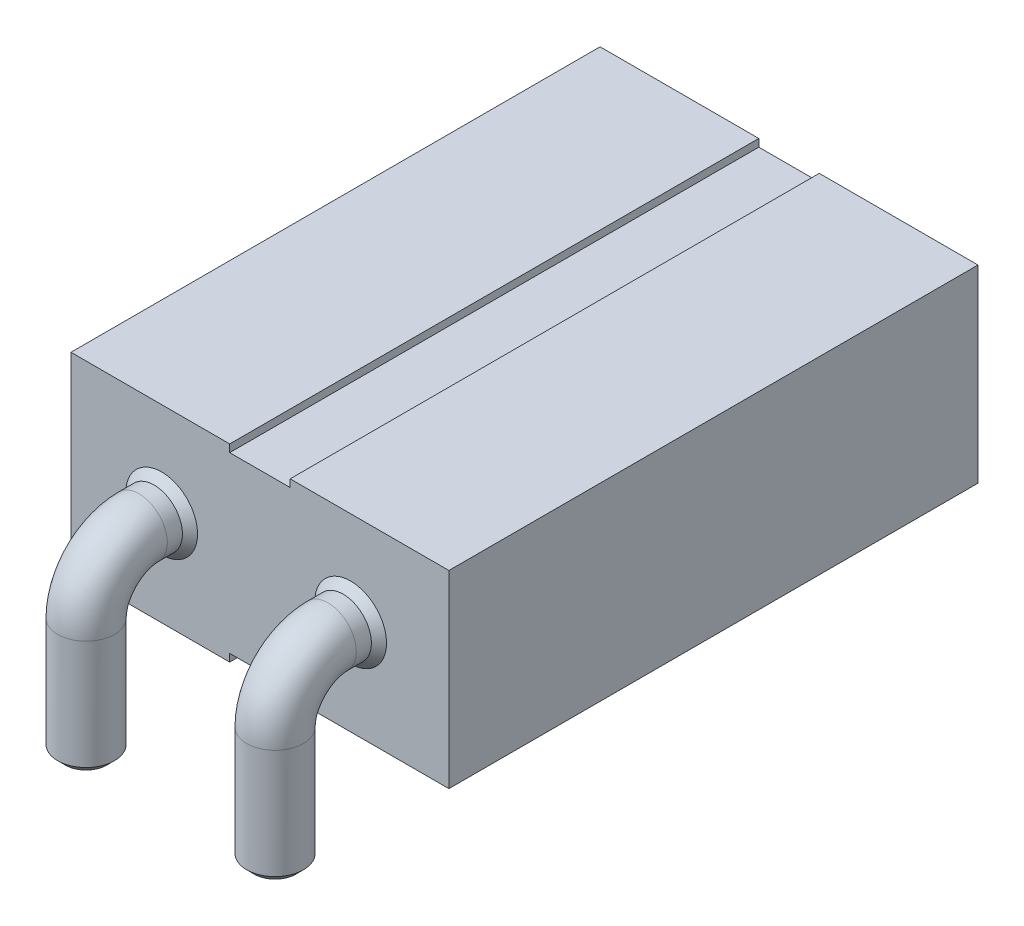
ISO-10303-21;
HEADER;
FILE_DESCRIPTION(('STEP AP214'),'2;1');
FILE_NAME('part.step','',(''),(''),'','','');
FILE_SCHEMA(('AUTOMOTIVE_DESIGN { 1 0 10303 214 1 1 1 1 }'));
ENDSEC;
DATA;
#1=APPLICATION_CONTEXT('core data for automotive mechanical design processes');
#2=APPLICATION_PROTOCOL_DEFINITION('international standard','automotive_design',2000,#1);
#3=PRODUCT_CONTEXT('',#1,'mechanical');
#4=PRODUCT('Part','Part','',(#3));
#5=PRODUCT_RELATED_PRODUCT_CATEGORY('part','',(#4));
#6=PRODUCT_DEFINITION_FORMATION('','',#4);
#7=PRODUCT_DEFINITION_CONTEXT('part definition',#1,'design');
#8=PRODUCT_DEFINITION('design','',#6,#7);
#9=PRODUCT_DEFINITION_SHAPE('','',#8);
#10=(LENGTH_UNIT() NAMED_UNIT(*) SI_UNIT(.MILLI.,.METRE.));
#11=(NAMED_UNIT(*) PLANE_ANGLE_UNIT() SI_UNIT($,.RADIAN.));
#12=(NAMED_UNIT(*) SI_UNIT($,.STERADIAN.) SOLID_ANGLE_UNIT());
#13=UNCERTAINTY_MEASURE_WITH_UNIT(LENGTH_MEASURE(1.E-05),#10,'distance_accuracy_value','');
#14=(GEOMETRIC_REPRESENTATION_CONTEXT(3) GLOBAL_UNCERTAINTY_ASSIGNED_CONTEXT((#13)) GLOBAL_UNIT_ASSIGNED_CONTEXT((#10,
#11,#12)) REPRESENTATION_CONTEXT('',''));
#15=CARTESIAN_POINT('',(0.,0.,0.));
#16=DIRECTION('',(0.,0.,1.));
#17=DIRECTION('',(1.,0.,0.));
#18=AXIS2_PLACEMENT_3D('',#15,#16,#17);
#19=CARTESIAN_POINT('',(-2.50000000000002,2.5,3.50000000000001));
#20=DIRECTION('',(0.,0.,-1.));
#21=DIRECTION('',(-1.,0.,0.));
#22=AXIS2_PLACEMENT_3D('',#19,#20,#21);
#23=PLANE('',#22);
#24=CARTESIAN_POINT('',(-1.30000000000002,1.25420841678192,3.50000000000001));
#25=DIRECTION('',(0.,0.,-1.));
#26=DIRECTION('',(-1.,0.,0.));
#27=AXIS2_PLACEMENT_3D('',#24,#25,#26);
#28=CIRCLE('',#27,0.474999999999999);
#29=CARTESIAN_POINT('',(-1.77500000000001,1.25420841678192,3.50000000000001));
#30=VERTEX_POINT('',#29);
#31=EDGE_CURVE('E11',#30,#30,#28,.T.);
#32=ORIENTED_EDGE('',*,*,#31,.T.);
#33=EDGE_LOOP('',(#32));
#34=FACE_BOUND('',#33,.T.);
#35=DIRECTION('',(0.,-1.,0.));
#36=VECTOR('',#35,1.);
#37=CARTESIAN_POINT('',(-0.400000000000016,2.5,3.50000000000001));
#38=LINE('',#37,#36);
#39=CARTESIAN_POINT('',(-0.400000000000016,0.0999999999999998,3.50000000000001));
#40=VERTEX_POINT('',#39);
#41=CARTESIAN_POINT('',(-0.400000000000016,0.,3.50000000000001));
#42=VERTEX_POINT('',#41);
#43=EDGE_CURVE('E155',#40,#42,#38,.T.);
#44=ORIENTED_EDGE('',*,*,#43,.F.);
#45=DIRECTION('',(-1.,0.,0.));
#46=VECTOR('',#45,1.);
#47=CARTESIAN_POINT('',(-2.50000000000002,0.0999999999999998,3.50000000000001));
#48=LINE('',#47,#46);
#49=CARTESIAN_POINT('',(0.399999999999984,0.0999999999999998,3.50000000000001));
#50=VERTEX_POINT('',#49);
#51=EDGE_CURVE('E132',#50,#40,#48,.T.);
#52=ORIENTED_EDGE('',*,*,#51,.F.);
#53=DIRECTION('',(0.,1.,0.));
#54=VECTOR('',#53,1.);
#55=CARTESIAN_POINT('',(0.399999999999985,2.5,3.50000000000001));
#56=LINE('',#55,#54);
#57=CARTESIAN_POINT('',(0.399999999999984,0.,3.50000000000001));
#58=VERTEX_POINT('',#57);
#59=EDGE_CURVE('E152',#58,#50,#56,.T.);
#60=ORIENTED_EDGE('',*,*,#59,.F.);
#61=DIRECTION('',(1.,0.,0.));
#62=VECTOR('',#61,1.);
#63=CARTESIAN_POINT('',(-2.50000000000002,0.,3.50000000000001));
#64=LINE('',#63,#62);
#65=CARTESIAN_POINT('',(2.49999999999998,0.,3.50000000000001));
#66=VERTEX_POINT('',#65);
#67=EDGE_CURVE('E212',#58,#66,#64,.T.);
#68=ORIENTED_EDGE('',*,*,#67,.T.);
#69=DIRECTION('',(0.,-1.,0.));
#70=VECTOR('',#69,1.);
#71=CARTESIAN_POINT('',(2.49999999999998,2.5,3.50000000000001));
#72=LINE('',#71,#70);
#73=CARTESIAN_POINT('',(2.49999999999998,2.5,3.50000000000001));
#74=VERTEX_POINT('',#73);
#75=EDGE_CURVE('E204',#74,#66,#72,.T.);
#76=ORIENTED_EDGE('',*,*,#75,.F.);
#77=DIRECTION('',(1.,0.,0.));
#78=VECTOR('',#77,1.);
#79=CARTESIAN_POINT('',(-2.50000000000002,2.5,3.50000000000001));
#80=LINE('',#79,#78);
#81=CARTESIAN_POINT('',(0.399999999999985,2.5,3.50000000000001));
#82=VERTEX_POINT('',#81);
#83=EDGE_CURVE('E200',#82,#74,#80,.T.);
#84=ORIENTED_EDGE('',*,*,#83,.F.);
#85=DIRECTION('',(0.,-1.,0.));
#86=VECTOR('',#85,1.);
#87=CARTESIAN_POINT('',(0.399999999999985,2.5,3.50000000000001));
#88=LINE('',#87,#86);
#89=CARTESIAN_POINT('',(0.399999999999984,2.4,3.50000000000001));
#90=VERTEX_POINT('',#89);
#91=EDGE_CURVE('E58',#82,#90,#88,.T.);
#92=ORIENTED_EDGE('',*,*,#91,.T.);
#93=DIRECTION('',(-1.,0.,0.));
#94=VECTOR('',#93,1.);
#95=CARTESIAN_POINT('',(-2.50000000000002,2.4,3.50000000000001));
#96=LINE('',#95,#94);
#97=CARTESIAN_POINT('',(-0.400000000000016,2.4,3.50000000000001));
#98=VERTEX_POINT('',#97);
#99=EDGE_CURVE('E174',#90,#98,#96,.T.);
#100=ORIENTED_EDGE('',*,*,#99,.T.);
#101=DIRECTION('',(0.,1.,0.));
#102=VECTOR('',#101,1.);
#103=CARTESIAN_POINT('',(-0.400000000000016,2.5,3.50000000000001));
#104=LINE('',#103,#102);
#105=CARTESIAN_POINT('',(-0.400000000000016,2.5,3.50000000000001));
#106=VERTEX_POINT('',#105);
#107=EDGE_CURVE('E171',#98,#106,#104,.T.);
#108=ORIENTED_EDGE('',*,*,#107,.T.);
#109=CARTESIAN_POINT('',(-2.50000000000002,2.5,3.50000000000001));
#110=VERTEX_POINT('',#109);
#111=EDGE_CURVE('E201',#110,#106,#80,.T.);
#112=ORIENTED_EDGE('',*,*,#111,.F.);
#113=DIRECTION('',(0.,-1.,0.));
#114=VECTOR('',#113,1.);
#115=CARTESIAN_POINT('',(-2.50000000000002,2.5,3.50000000000001));
#116=LINE('',#115,#114);
#117=CARTESIAN_POINT('',(-2.50000000000002,0.,3.50000000000001));
#118=VERTEX_POINT('',#117);
#119=EDGE_CURVE('E217',#110,#118,#116,.T.);
#120=ORIENTED_EDGE('',*,*,#119,.T.);
#121=EDGE_CURVE('E194',#118,#42,#64,.T.);
#122=ORIENTED_EDGE('',*,*,#121,.T.);
#123=EDGE_LOOP('',(#44,#52,#60,#68,#76,#84,#92,#100,#108,#112,#120,#122));
#124=FACE_BOUND('',#123,.T.);
#125=CARTESIAN_POINT('',(1.19999999999998,1.25420841678192,3.50000000000001));
#126=DIRECTION('',(0.,0.,-1.));
#127=DIRECTION('',(-1.,0.,0.));
#128=AXIS2_PLACEMENT_3D('',#125,#126,#127);
#129=CIRCLE('',#128,0.475000000000001);
#130=CARTESIAN_POINT('',(0.724999999999983,1.25420841678192,3.50000000000001));
#131=VERTEX_POINT('',#130);
#132=EDGE_CURVE('E235',#131,#131,#129,.T.);
#133=ORIENTED_EDGE('',*,*,#132,.T.);
#134=EDGE_LOOP('',(#133));
#135=FACE_BOUND('',#134,.T.);
#136=ADVANCED_FACE('F35',(#34,#124,#135),#23,.F.);
#137=CARTESIAN_POINT('',(-2.50000000000002,2.5,-3.49999999999999));
#138=DIRECTION('',(0.,0.,1.));
#139=DIRECTION('',(1.,0.,0.));
#140=AXIS2_PLACEMENT_3D('',#137,#138,#139);
#141=PLANE('',#140);
#142=CARTESIAN_POINT('',(-1.30000000000002,1.25,-3.49999999999999));
#143=DIRECTION('',(0.,0.,-1.));
#144=DIRECTION('',(-1.,0.,0.));
#145=AXIS2_PLACEMENT_3D('',#142,#143,#144);
#146=CIRCLE('',#145,0.75);
#147=CARTESIAN_POINT('',(-2.05000000000002,1.25,-3.49999999999999));
#148=VERTEX_POINT('',#147);
#149=EDGE_CURVE('E567',#148,#148,#146,.T.);
#150=ORIENTED_EDGE('',*,*,#149,.F.);
#151=EDGE_LOOP('',(#150));
#152=FACE_BOUND('',#151,.T.);
#153=CARTESIAN_POINT('',(1.19999999999998,1.25,-3.49999999999999));
#154=DIRECTION('',(0.,0.,-1.));
#155=DIRECTION('',(-1.,0.,0.));
#156=AXIS2_PLACEMENT_3D('',#153,#154,#155);
#157=CIRCLE('',#156,0.75);
#158=CARTESIAN_POINT('',(0.449999999999985,1.25,-3.49999999999999));
#159=VERTEX_POINT('',#158);
#160=EDGE_CURVE('E183',#159,#159,#157,.T.);
#161=ORIENTED_EDGE('',*,*,#160,.F.);
#162=EDGE_LOOP('',(#161));
#163=FACE_BOUND('',#162,.T.);
#164=DIRECTION('',(0.,-1.,0.));
#165=VECTOR('',#164,1.);
#166=CARTESIAN_POINT('',(-0.400000000000016,0.0999999999999998,-3.49999999999999));
#167=LINE('',#166,#165);
#168=CARTESIAN_POINT('',(-0.400000000000016,0.0999999999999998,-3.49999999999999));
#169=VERTEX_POINT('',#168);
#170=CARTESIAN_POINT('',(-0.400000000000016,0.,-3.49999999999999));
#171=VERTEX_POINT('',#170);
#172=EDGE_CURVE('E138',#169,#171,#167,.T.);
#173=ORIENTED_EDGE('',*,*,#172,.T.);
#174=DIRECTION('',(-1.,0.,0.));
#175=VECTOR('',#174,1.);
#176=CARTESIAN_POINT('',(-2.50000000000002,0.,-3.49999999999999));
#177=LINE('',#176,#175);
#178=CARTESIAN_POINT('',(-2.50000000000002,0.,-3.49999999999999));
#179=VERTEX_POINT('',#178);
#180=EDGE_CURVE('E207',#171,#179,#177,.T.);
#181=ORIENTED_EDGE('',*,*,#180,.T.);
#182=DIRECTION('',(0.,-1.,0.));
#183=VECTOR('',#182,1.);
#184=CARTESIAN_POINT('',(-2.50000000000002,2.5,-3.49999999999999));
#185=LINE('',#184,#183);
#186=CARTESIAN_POINT('',(-2.50000000000002,2.5,-3.49999999999999));
#187=VERTEX_POINT('',#186);
#188=EDGE_CURVE('E220',#187,#179,#185,.T.);
#189=ORIENTED_EDGE('',*,*,#188,.F.);
#190=DIRECTION('',(-1.,0.,0.));
#191=VECTOR('',#190,1.);
#192=CARTESIAN_POINT('',(-2.50000000000002,2.5,-3.49999999999999));
#193=LINE('',#192,#191);
#194=CARTESIAN_POINT('',(-0.400000000000016,2.5,-3.49999999999999));
#195=VERTEX_POINT('',#194);
#196=EDGE_CURVE('E193',#195,#187,#193,.T.);
#197=ORIENTED_EDGE('',*,*,#196,.F.);
#198=DIRECTION('',(0.,1.,0.));
#199=VECTOR('',#198,1.);
#200=CARTESIAN_POINT('',(-0.400000000000016,2.4,-3.49999999999999));
#201=LINE('',#200,#199);
#202=CARTESIAN_POINT('',(-0.400000000000016,2.4,-3.49999999999999));
#203=VERTEX_POINT('',#202);
#204=EDGE_CURVE('E158',#203,#195,#201,.T.);
#205=ORIENTED_EDGE('',*,*,#204,.F.);
#206=DIRECTION('',(-1.,0.,0.));
#207=VECTOR('',#206,1.);
#208=CARTESIAN_POINT('',(0.399999999999984,2.4,-3.49999999999999));
#209=LINE('',#208,#207);
#210=CARTESIAN_POINT('',(0.399999999999984,2.4,-3.49999999999999));
#211=VERTEX_POINT('',#210);
#212=EDGE_CURVE('E163',#211,#203,#209,.T.);
#213=ORIENTED_EDGE('',*,*,#212,.F.);
#214=DIRECTION('',(0.,-1.,0.));
#215=VECTOR('',#214,1.);
#216=CARTESIAN_POINT('',(0.399999999999984,2.4,-3.49999999999999));
#217=LINE('',#216,#215);
#218=CARTESIAN_POINT('',(0.399999999999984,2.5,-3.49999999999999));
#219=VERTEX_POINT('',#218);
#220=EDGE_CURVE('E160',#219,#211,#217,.T.);
#221=ORIENTED_EDGE('',*,*,#220,.F.);
#222=CARTESIAN_POINT('',(2.49999999999998,2.5,-3.49999999999999));
#223=VERTEX_POINT('',#222);
#224=EDGE_CURVE('E195',#223,#219,#193,.T.);
#225=ORIENTED_EDGE('',*,*,#224,.F.);
#226=DIRECTION('',(0.,-1.,0.));
#227=VECTOR('',#226,1.);
#228=CARTESIAN_POINT('',(2.49999999999998,2.5,-3.49999999999999));
#229=LINE('',#228,#227);
#230=CARTESIAN_POINT('',(2.49999999999998,0.,-3.49999999999999));
#231=VERTEX_POINT('',#230);
#232=EDGE_CURVE('E223',#223,#231,#229,.T.);
#233=ORIENTED_EDGE('',*,*,#232,.T.);
#234=CARTESIAN_POINT('',(0.399999999999985,0.,-3.49999999999999));
#235=VERTEX_POINT('',#234);
#236=EDGE_CURVE('E208',#231,#235,#177,.T.);
#237=ORIENTED_EDGE('',*,*,#236,.T.);
#238=DIRECTION('',(0.,1.,0.));
#239=VECTOR('',#238,1.);
#240=CARTESIAN_POINT('',(0.399999999999984,0.0999999999999998,-3.49999999999999));
#241=LINE('',#240,#239);
#242=CARTESIAN_POINT('',(0.399999999999984,0.0999999999999998,-3.49999999999999));
#243=VERTEX_POINT('',#242);
#244=EDGE_CURVE('E50',#235,#243,#241,.T.);
#245=ORIENTED_EDGE('',*,*,#244,.T.);
#246=DIRECTION('',(-1.,0.,0.));
#247=VECTOR('',#246,1.);
#248=CARTESIAN_POINT('',(0.399999999999984,0.0999999999999998,-3.49999999999999));
#249=LINE('',#248,#247);
#250=EDGE_CURVE('E130',#243,#169,#249,.T.);
#251=ORIENTED_EDGE('',*,*,#250,.T.);
#252=EDGE_LOOP('',(#173,#181,#189,#197,#205,#213,#221,#225,#233,#237,#245,#251));
#253=FACE_BOUND('',#252,.T.);
#254=ADVANCED_FACE('F146',(#152,#163,#253),#141,.F.);
#255=CARTESIAN_POINT('',(0.,0.,0.));
#256=DIRECTION('',(0.,-1.,0.));
#257=DIRECTION('',(0.,0.,-1.));
#258=AXIS2_PLACEMENT_3D('',#255,#256,#257);
#259=PLANE('',#258);
#260=ORIENTED_EDGE('',*,*,#180,.F.);
#261=DIRECTION('',(0.,0.,1.));
#262=VECTOR('',#261,1.);
#263=CARTESIAN_POINT('',(-0.400000000000016,0.,0.));
#264=LINE('',#263,#262);
#265=EDGE_CURVE('E141',#171,#42,#264,.T.);
#266=ORIENTED_EDGE('',*,*,#265,.T.);
#267=ORIENTED_EDGE('',*,*,#121,.F.);
#268=DIRECTION('',(0.,0.,1.));
#269=VECTOR('',#268,1.);
#270=CARTESIAN_POINT('',(-2.50000000000002,0.,3.50000000000001));
#271=LINE('',#270,#269);
#272=EDGE_CURVE('E210',#179,#118,#271,.T.);
#273=ORIENTED_EDGE('',*,*,#272,.F.);
#274=EDGE_LOOP('',(#260,#266,#267,#273));
#275=FACE_BOUND('',#274,.T.);
#276=ADVANCED_FACE('F272',(#275),#259,.T.);
#277=ORIENTED_EDGE('',*,*,#67,.F.);
#278=DIRECTION('',(0.,0.,-1.));
#279=VECTOR('',#278,1.);
#280=CARTESIAN_POINT('',(0.399999999999984,0.,0.));
#281=LINE('',#280,#279);
#282=EDGE_CURVE('E243',#58,#235,#281,.T.);
#283=ORIENTED_EDGE('',*,*,#282,.T.);
#284=ORIENTED_EDGE('',*,*,#236,.F.);
#285=DIRECTION('',(0.,0.,-1.));
#286=VECTOR('',#285,1.);
#287=CARTESIAN_POINT('',(2.49999999999998,0.,3.50000000000001));
#288=LINE('',#287,#286);
#289=EDGE_CURVE('E187',#66,#231,#288,.T.);
#290=ORIENTED_EDGE('',*,*,#289,.F.);
#291=EDGE_LOOP('',(#277,#283,#284,#290));
#292=FACE_BOUND('',#291,.T.);
#293=ADVANCED_FACE('F339',(#292),#259,.T.);
#294=CARTESIAN_POINT('',(0.,2.5,0.));
#295=DIRECTION('',(0.,-1.,0.));
#296=DIRECTION('',(0.,0.,-1.));
#297=AXIS2_PLACEMENT_3D('',#294,#295,#296);
#298=PLANE('',#297);
#299=ORIENTED_EDGE('',*,*,#111,.T.);
#300=DIRECTION('',(0.,0.,-1.));
#301=VECTOR('',#300,1.);
#302=CARTESIAN_POINT('',(-0.400000000000016,2.5,0.));
#303=LINE('',#302,#301);
#304=EDGE_CURVE('E240',#106,#195,#303,.T.);
#305=ORIENTED_EDGE('',*,*,#304,.T.);
#306=ORIENTED_EDGE('',*,*,#196,.T.);
#307=DIRECTION('',(0.,0.,1.));
#308=VECTOR('',#307,1.);
#309=CARTESIAN_POINT('',(-2.50000000000002,2.5,3.50000000000001));
#310=LINE('',#309,#308);
#311=EDGE_CURVE('E198',#187,#110,#310,.T.);
#312=ORIENTED_EDGE('',*,*,#311,.T.);
#313=EDGE_LOOP('',(#299,#305,#306,#312));
#314=FACE_BOUND('',#313,.T.);
#315=ADVANCED_FACE('F287',(#314),#298,.F.);
#316=CARTESIAN_POINT('',(2.49999999999998,2.5,3.50000000000001));
#317=DIRECTION('',(-1.,0.,0.));
#318=DIRECTION('',(0.,0.,1.));
#319=AXIS2_PLACEMENT_3D('',#316,#317,#318);
#320=PLANE('',#319);
#321=ORIENTED_EDGE('',*,*,#289,.T.);
#322=ORIENTED_EDGE('',*,*,#232,.F.);
#323=DIRECTION('',(0.,0.,-1.));
#324=VECTOR('',#323,1.);
#325=CARTESIAN_POINT('',(2.49999999999998,2.5,3.50000000000001));
#326=LINE('',#325,#324);
#327=EDGE_CURVE('E190',#74,#223,#326,.T.);
#328=ORIENTED_EDGE('',*,*,#327,.F.);
#329=ORIENTED_EDGE('',*,*,#75,.T.);
#330=EDGE_LOOP('',(#321,#322,#328,#329));
#331=FACE_BOUND('',#330,.T.);
#332=ADVANCED_FACE('F282',(#331),#320,.F.);
#333=CARTESIAN_POINT('',(-2.50000000000002,2.5,3.50000000000001));
#334=DIRECTION('',(1.,0.,0.));
#335=DIRECTION('',(0.,0.,-1.));
#336=AXIS2_PLACEMENT_3D('',#333,#334,#335);
#337=PLANE('',#336);
#338=ORIENTED_EDGE('',*,*,#272,.T.);
#339=ORIENTED_EDGE('',*,*,#119,.F.);
#340=ORIENTED_EDGE('',*,*,#311,.F.);
#341=ORIENTED_EDGE('',*,*,#188,.T.);
#342=EDGE_LOOP('',(#338,#339,#340,#341));
#343=FACE_BOUND('',#342,.T.);
#344=ADVANCED_FACE('F279',(#343),#337,.F.);
#345=ORIENTED_EDGE('',*,*,#224,.T.);
#346=DIRECTION('',(0.,0.,1.));
#347=VECTOR('',#346,1.);
#348=CARTESIAN_POINT('',(0.399999999999984,2.5,0.));
#349=LINE('',#348,#347);
#350=EDGE_CURVE('E238',#219,#82,#349,.T.);
#351=ORIENTED_EDGE('',*,*,#350,.T.);
#352=ORIENTED_EDGE('',*,*,#83,.T.);
#353=ORIENTED_EDGE('',*,*,#327,.T.);
#354=EDGE_LOOP('',(#345,#351,#352,#353));
#355=FACE_BOUND('',#354,.T.);
#356=ADVANCED_FACE('F281',(#355),#298,.F.);
#357=CARTESIAN_POINT('',(1.19999999999998,1.25,3.00000000000001));
#358=DIRECTION('',(0.,0.,-1.));
#359=DIRECTION('',(-1.,0.,0.));
#360=AXIS2_PLACEMENT_3D('',#357,#358,#359);
#361=CYLINDRICAL_SURFACE('',#360,0.75);
#362=CARTESIAN_POINT('',(1.19999999999998,1.25,3.00000000000001));
#363=DIRECTION('',(0.,0.,-1.));
#364=DIRECTION('',(-1.,0.,0.));
#365=AXIS2_PLACEMENT_3D('',#362,#363,#364);
#366=CIRCLE('',#365,0.75);
#367=CARTESIAN_POINT('',(0.449999999999985,1.25,3.00000000000001));
#368=VERTEX_POINT('',#367);
#369=EDGE_CURVE('E184',#368,#368,#366,.T.);
#370=CARTESIAN_POINT('',(0.449999999999985,1.25,3.00000000000001));
#371=CARTESIAN_POINT('',(0.449999999999985,1.25,2.93229166666668));
#372=CARTESIAN_POINT('',(0.449999999999985,1.25,2.86458333333334));
#373=CARTESIAN_POINT('',(0.449999999999985,1.25,2.72916666666668));
#374=CARTESIAN_POINT('',(0.449999999999985,1.25,2.66145833333334));
#375=CARTESIAN_POINT('',(0.449999999999985,1.25,2.52604166666668));
#376=CARTESIAN_POINT('',(0.449999999999985,1.25,2.45833333333334));
#377=CARTESIAN_POINT('',(0.449999999999985,1.25,2.32291666666668));
#378=CARTESIAN_POINT('',(0.449999999999985,1.25,2.25520833333334));
#379=CARTESIAN_POINT('',(0.449999999999985,1.25,2.11979166666668));
#380=CARTESIAN_POINT('',(0.449999999999985,1.25,2.05208333333334));
#381=CARTESIAN_POINT('',(0.449999999999985,1.25,1.91666666666668));
#382=CARTESIAN_POINT('',(0.449999999999985,1.25,1.84895833333334));
#383=CARTESIAN_POINT('',(0.449999999999985,1.25,1.71354166666668));
#384=CARTESIAN_POINT('',(0.449999999999985,1.25,1.64583333333334));
#385=CARTESIAN_POINT('',(0.449999999999985,1.25,1.51041666666668));
#386=CARTESIAN_POINT('',(0.449999999999985,1.25,1.44270833333334));
#387=CARTESIAN_POINT('',(0.449999999999985,1.25,1.30729166666668));
#388=CARTESIAN_POINT('',(0.449999999999985,1.25,1.23958333333334));
#389=CARTESIAN_POINT('',(0.449999999999985,1.25,1.10416666666668));
#390=CARTESIAN_POINT('',(0.449999999999985,1.25,1.03645833333334));
#391=CARTESIAN_POINT('',(0.449999999999985,1.25,0.901041666666678));
#392=CARTESIAN_POINT('',(0.449999999999985,1.25,0.833333333333344));
#393=CARTESIAN_POINT('',(0.449999999999985,1.25,0.697916666666678));
#394=CARTESIAN_POINT('',(0.449999999999985,1.25,0.630208333333344));
#395=CARTESIAN_POINT('',(0.449999999999985,1.25,0.494791666666678));
#396=CARTESIAN_POINT('',(0.449999999999985,1.25,0.427083333333344));
#397=CARTESIAN_POINT('',(0.449999999999985,1.25,0.291666666666678));
#398=CARTESIAN_POINT('',(0.449999999999985,1.25,0.223958333333344));
#399=CARTESIAN_POINT('',(0.449999999999985,1.25,0.0885416666666777));
#400=CARTESIAN_POINT('',(0.449999999999985,1.25,0.0208333333333445));
#401=CARTESIAN_POINT('',(0.449999999999985,1.25,-0.114583333333322));
#402=CARTESIAN_POINT('',(0.449999999999985,1.25,-0.182291666666656));
#403=CARTESIAN_POINT('',(0.449999999999985,1.25,-0.317708333333322));
#404=CARTESIAN_POINT('',(0.449999999999985,1.25,-0.385416666666656));
#405=CARTESIAN_POINT('',(0.449999999999985,1.25,-0.520833333333322));
#406=CARTESIAN_POINT('',(0.449999999999985,1.25,-0.588541666666656));
#407=CARTESIAN_POINT('',(0.449999999999985,1.25,-0.723958333333322));
#408=CARTESIAN_POINT('',(0.449999999999985,1.25,-0.791666666666656));
#409=CARTESIAN_POINT('',(0.449999999999985,1.25,-0.927083333333322));
#410=CARTESIAN_POINT('',(0.449999999999985,1.25,-0.994791666666656));
#411=CARTESIAN_POINT('',(0.449999999999985,1.25,-1.13020833333332));
#412=CARTESIAN_POINT('',(0.449999999999985,1.25,-1.19791666666666));
#413=CARTESIAN_POINT('',(0.449999999999985,1.25,-1.33333333333332));
#414=CARTESIAN_POINT('',(0.449999999999985,1.25,-1.40104166666666));
#415=CARTESIAN_POINT('',(0.449999999999985,1.25,-1.53645833333332));
#416=CARTESIAN_POINT('',(0.449999999999985,1.25,-1.60416666666666));
#417=CARTESIAN_POINT('',(0.449999999999985,1.25,-1.73958333333332));
#418=CARTESIAN_POINT('',(0.449999999999985,1.25,-1.80729166666666));
#419=CARTESIAN_POINT('',(0.449999999999985,1.25,-1.94270833333332));
#420=CARTESIAN_POINT('',(0.449999999999985,1.25,-2.01041666666666));
#421=CARTESIAN_POINT('',(0.449999999999985,1.25,-2.14583333333332));
#422=CARTESIAN_POINT('',(0.449999999999985,1.25,-2.21354166666666));
#423=CARTESIAN_POINT('',(0.449999999999985,1.25,-2.34895833333332));
#424=CARTESIAN_POINT('',(0.449999999999985,1.25,-2.41666666666666));
#425=CARTESIAN_POINT('',(0.449999999999985,1.25,-2.55208333333332));
#426=CARTESIAN_POINT('',(0.449999999999985,1.25,-2.61979166666666));
#427=CARTESIAN_POINT('',(0.449999999999985,1.25,-2.75520833333332));
#428=CARTESIAN_POINT('',(0.449999999999985,1.25,-2.82291666666666));
#429=CARTESIAN_POINT('',(0.449999999999985,1.25,-2.95833333333332));
#430=CARTESIAN_POINT('',(0.449999999999985,1.25,-3.02604166666666));
#431=CARTESIAN_POINT('',(0.449999999999985,1.25,-3.16145833333332));
#432=CARTESIAN_POINT('',(0.449999999999985,1.25,-3.22916666666666));
#433=CARTESIAN_POINT('',(0.449999999999985,1.25,-3.36458333333332));
#434=CARTESIAN_POINT('',(0.449999999999985,1.25,-3.43229166666666));
#435=CARTESIAN_POINT('',(0.449999999999985,1.25,-3.49999999999999));
#436=B_SPLINE_CURVE_WITH_KNOTS('',3,(#370,#371,#372,#373,#374,#375,#376,#377,#378,#379,#380,
#381,#382,#383,#384,#385,#386,#387,#388,#389,#390,#391,#392,#393,#394,#395,#396,#397,#398,#399,
#400,#401,#402,#403,#404,#405,#406,#407,#408,#409,#410,#411,#412,#413,#414,#415,#416,#417,#418,
#419,#420,#421,#422,#423,#424,#425,#426,#427,#428,#429,#430,#431,#432,#433,#434,#435),
.UNSPECIFIED.,.F.,.F.,(4,2,2,2,2,2,2,2,2,2,2,2,2,2,2,2,2,2,2,2,2,2,2,2,2,2,2,2,2,2,2,2,4),(0.,
0.203125,0.40625,0.609375,0.8125,1.015625,1.21875,1.421875,1.625,1.828125,2.03125,2.234375,
2.4375,2.640625,2.84375,3.046875,3.25,3.453125,3.65625,3.859375,4.0625,4.265625,4.46875,
4.671875,4.875,5.078125,5.28125,5.484375,5.6875,5.890625,6.09375,6.296875,6.5),.UNSPECIFIED.);
#437=EDGE_CURVE('BSEAM328',#368,#159,#436,.T.);
#438=ORIENTED_EDGE('',*,*,#369,.F.);
#439=ORIENTED_EDGE('',*,*,#160,.T.);
#440=ORIENTED_EDGE('',*,*,#437,.T.);
#441=ORIENTED_EDGE('',*,*,#437,.F.);
#442=EDGE_LOOP('',(#438,#440,#439,#441));
#443=FACE_BOUND('',#442,.T.);
#444=ADVANCED_FACE('F328',(#443),#361,.F.);
#445=CARTESIAN_POINT('',(1.19999999999998,1.25,3.00000000000001));
#446=DIRECTION('',(0.,0.,-1.));
#447=DIRECTION('',(-1.,0.,0.));
#448=AXIS2_PLACEMENT_3D('',#445,#446,#447);
#449=PLANE('',#448);
#450=ORIENTED_EDGE('',*,*,#369,.T.);
#451=EDGE_LOOP('',(#450));
#452=FACE_BOUND('',#451,.T.);
#453=ADVANCED_FACE('F322',(#452),#449,.T.);
#454=CARTESIAN_POINT('',(1.19999999999998,0.554208416781916,4.50000000000001));
#455=DIRECTION('',(0.,-1.,0.));
#456=DIRECTION('',(0.,0.,-1.));
#457=AXIS2_PLACEMENT_3D('',#454,#455,#456);
#458=CYLINDRICAL_SURFACE('',#457,0.375);
#459=CARTESIAN_POINT('',(1.19999999999998,-0.892950223590586,4.50000000000001));
#460=DIRECTION('',(0.,-1.,0.));
#461=DIRECTION('',(0.,0.,-1.));
#462=AXIS2_PLACEMENT_3D('',#459,#460,#461);
#463=CIRCLE('',#462,0.375);
#464=CARTESIAN_POINT('',(1.19999999999998,-0.892950223590586,4.12500000000001));
#465=VERTEX_POINT('',#464);
#466=EDGE_CURVE('E229',#465,#465,#463,.F.);
#467=ORIENTED_EDGE('',*,*,#466,.T.);
#468=EDGE_LOOP('',(#467));
#469=FACE_BOUND('',#468,.T.);
#470=CARTESIAN_POINT('',(1.19999999999998,0.554208416781916,4.50000000000001));
#471=DIRECTION('',(0.,-1.,0.));
#472=DIRECTION('',(1.,0.,0.));
#473=AXIS2_PLACEMENT_3D('',#470,#471,#472);
#474=CIRCLE('',#473,0.375);
#475=CARTESIAN_POINT('',(1.19999999999998,0.554208416781914,4.87500000000001));
#476=VERTEX_POINT('',#475);
#477=EDGE_CURVE('E180',#476,#476,#474,.T.);
#478=ORIENTED_EDGE('',*,*,#477,.T.);
#479=EDGE_LOOP('',(#478));
#480=FACE_BOUND('',#479,.T.);
#481=ADVANCED_FACE('F317',(#469,#480),#458,.T.);
#482=CARTESIAN_POINT('',(1.19999999999998,0.554208416781921,3.80000000000001));
#483=DIRECTION('',(1.,0.,0.));
#484=DIRECTION('',(0.,0.,-1.));
#485=AXIS2_PLACEMENT_3D('',#482,#483,#484);
#486=TOROIDAL_SURFACE('',#485,0.7,0.375);
#487=CARTESIAN_POINT('',(1.19999999999998,1.25420841678192,3.80000000000001));
#488=DIRECTION('',(0.,0.,1.));
#489=DIRECTION('',(1.,0.,0.));
#490=AXIS2_PLACEMENT_3D('',#487,#488,#489);
#491=CIRCLE('',#490,0.375);
#492=CARTESIAN_POINT('',(1.19999999999998,1.62920841678192,3.8));
#493=VERTEX_POINT('',#492);
#494=EDGE_CURVE('E177',#493,#493,#491,.T.);
#495=CARTESIAN_POINT('',(1.19999999999998,0.554208416781921,3.80000000000001));
#496=DIRECTION('',(1.,0.,0.));
#497=DIRECTION('',(0.,0.,-1.));
#498=AXIS2_PLACEMENT_3D('',#495,#496,#497);
#499=CIRCLE('',#498,1.075);
#500=EDGE_CURVE('',#493,#476,#499,.T.);
#501=ORIENTED_EDGE('',*,*,#494,.T.);
#502=ORIENTED_EDGE('',*,*,#477,.F.);
#503=ORIENTED_EDGE('',*,*,#500,.T.);
#504=ORIENTED_EDGE('',*,*,#500,.F.);
#505=EDGE_LOOP('',(#501,#503,#502,#504));
#506=FACE_BOUND('',#505,.T.);
#507=ADVANCED_FACE('F311',(#506),#486,.T.);
#508=CARTESIAN_POINT('',(1.19999999999998,1.25420841678192,3.80000000000001));
#509=DIRECTION('',(0.,0.,-1.));
#510=DIRECTION('',(-1.,0.,0.));
#511=AXIS2_PLACEMENT_3D('',#508,#509,#510);
#512=CYLINDRICAL_SURFACE('',#511,0.375);
#513=CARTESIAN_POINT('',(1.19999999999998,1.25420841678192,3.60000000000001));
#514=DIRECTION('',(0.,0.,-1.));
#515=DIRECTION('',(-1.,0.,0.));
#516=AXIS2_PLACEMENT_3D('',#513,#514,#515);
#517=CIRCLE('',#516,0.375);
#518=CARTESIAN_POINT('',(0.824999999999985,1.25420841678192,3.60000000000001));
#519=VERTEX_POINT('',#518);
#520=EDGE_CURVE('E232',#519,#519,#517,.F.);
#521=ORIENTED_EDGE('',*,*,#520,.T.);
#522=EDGE_LOOP('',(#521));
#523=FACE_BOUND('',#522,.T.);
#524=ORIENTED_EDGE('',*,*,#494,.F.);
#525=EDGE_LOOP('',(#524));
#526=FACE_BOUND('',#525,.T.);
#527=ADVANCED_FACE('F308',(#523,#526),#512,.T.);
#528=CARTESIAN_POINT('',(1.19999999999998,-0.992950223590583,4.50000000000001));
#529=DIRECTION('',(0.,-1.,0.));
#530=DIRECTION('',(1.,0.,0.));
#531=AXIS2_PLACEMENT_3D('',#528,#529,#530);
#532=PLANE('',#531);
#533=CARTESIAN_POINT('',(1.19999999999998,-0.992950223590583,4.50000000000001));
#534=DIRECTION('',(0.,-1.,0.));
#535=DIRECTION('',(0.,0.,-1.));
#536=AXIS2_PLACEMENT_3D('',#533,#534,#535);
#537=CIRCLE('',#536,0.275000000000005);
#538=CARTESIAN_POINT('',(1.19999999999998,-0.992950223590579,4.22500000000001));
#539=VERTEX_POINT('',#538);
#540=EDGE_CURVE('E226',#539,#539,#537,.T.);
#541=ORIENTED_EDGE('',*,*,#540,.T.);
#542=EDGE_LOOP('',(#541));
#543=FACE_BOUND('',#542,.T.);
#544=ADVANCED_FACE('F293',(#543),#532,.T.);
#545=CARTESIAN_POINT('',(1.19999999999998,-0.992950223590583,4.50000000000001));
#546=DIRECTION('',(0.,1.,0.));
#547=DIRECTION('',(0.,0.,1.));
#548=AXIS2_PLACEMENT_3D('',#545,#546,#547);
#549=CONICAL_SURFACE('',#548,0.275000000000005,0.78539816339744);
#550=ORIENTED_EDGE('',*,*,#466,.F.);
#551=EDGE_LOOP('',(#550));
#552=FACE_BOUND('',#551,.T.);
#553=ORIENTED_EDGE('',*,*,#540,.F.);
#554=EDGE_LOOP('',(#553));
#555=FACE_BOUND('',#554,.T.);
#556=ADVANCED_FACE('F289',(#552,#555),#549,.T.);
#557=CARTESIAN_POINT('',(1.19999999999998,1.25420841678192,3.60000000000001));
#558=DIRECTION('',(0.,0.,-1.));
#559=DIRECTION('',(-1.,0.,0.));
#560=AXIS2_PLACEMENT_3D('',#557,#558,#559);
#561=CONICAL_SURFACE('',#560,0.375,0.785398163397444);
#562=ORIENTED_EDGE('',*,*,#132,.F.);
#563=EDGE_LOOP('',(#562));
#564=FACE_BOUND('',#563,.T.);
#565=ORIENTED_EDGE('',*,*,#520,.F.);
#566=EDGE_LOOP('',(#565));
#567=FACE_BOUND('',#566,.T.);
#568=ADVANCED_FACE('F292',(#564,#567),#561,.T.);
#569=CARTESIAN_POINT('',(0.399999999999984,2.4,4.87500000000001));
#570=DIRECTION('',(0.,-1.,0.));
#571=DIRECTION('',(0.,0.,-1.));
#572=AXIS2_PLACEMENT_3D('',#569,#570,#571);
#573=PLANE('',#572);
#574=DIRECTION('',(0.,0.,-1.));
#575=VECTOR('',#574,1.);
#576=CARTESIAN_POINT('',(0.399999999999984,2.4,4.87500000000001));
#577=LINE('',#576,#575);
#578=EDGE_CURVE('E166',#90,#211,#577,.T.);
#579=ORIENTED_EDGE('',*,*,#578,.T.);
#580=ORIENTED_EDGE('',*,*,#212,.T.);
#581=DIRECTION('',(0.,0.,-1.));
#582=VECTOR('',#581,1.);
#583=CARTESIAN_POINT('',(-0.400000000000016,2.4,4.87500000000001));
#584=LINE('',#583,#582);
#585=EDGE_CURVE('E167',#98,#203,#584,.T.);
#586=ORIENTED_EDGE('',*,*,#585,.F.);
#587=ORIENTED_EDGE('',*,*,#99,.F.);
#588=EDGE_LOOP('',(#579,#580,#586,#587));
#589=FACE_BOUND('',#588,.T.);
#590=ADVANCED_FACE('F296',(#589),#573,.F.);
#591=CARTESIAN_POINT('',(-0.400000000000016,2.4,4.87500000000001));
#592=DIRECTION('',(-1.,0.,0.));
#593=DIRECTION('',(0.,0.,1.));
#594=AXIS2_PLACEMENT_3D('',#591,#592,#593);
#595=PLANE('',#594);
#596=ORIENTED_EDGE('',*,*,#585,.T.);
#597=ORIENTED_EDGE('',*,*,#204,.T.);
#598=ORIENTED_EDGE('',*,*,#304,.F.);
#599=ORIENTED_EDGE('',*,*,#107,.F.);
#600=EDGE_LOOP('',(#596,#597,#598,#599));
#601=FACE_BOUND('',#600,.T.);
#602=ADVANCED_FACE('F301',(#601),#595,.F.);
#603=CARTESIAN_POINT('',(0.399999999999984,2.4,4.87500000000001));
#604=DIRECTION('',(1.,0.,0.));
#605=DIRECTION('',(0.,0.,-1.));
#606=AXIS2_PLACEMENT_3D('',#603,#604,#605);
#607=PLANE('',#606);
#608=ORIENTED_EDGE('',*,*,#350,.F.);
#609=ORIENTED_EDGE('',*,*,#220,.T.);
#610=ORIENTED_EDGE('',*,*,#578,.F.);
#611=ORIENTED_EDGE('',*,*,#91,.F.);
#612=EDGE_LOOP('',(#608,#609,#610,#611));
#613=FACE_BOUND('',#612,.T.);
#614=ADVANCED_FACE('F366',(#613),#607,.F.);
#615=CARTESIAN_POINT('',(0.399999999999984,0.0999999999999998,4.87500000000001));
#616=DIRECTION('',(0.,-1.,0.));
#617=DIRECTION('',(0.,0.,-1.));
#618=AXIS2_PLACEMENT_3D('',#615,#616,#617);
#619=PLANE('',#618);
#620=ORIENTED_EDGE('',*,*,#51,.T.);
#621=DIRECTION('',(0.,0.,-1.));
#622=VECTOR('',#621,1.);
#623=CARTESIAN_POINT('',(-0.400000000000016,0.0999999999999998,4.87500000000001));
#624=LINE('',#623,#622);
#625=EDGE_CURVE('E125',#40,#169,#624,.T.);
#626=ORIENTED_EDGE('',*,*,#625,.T.);
#627=ORIENTED_EDGE('',*,*,#250,.F.);
#628=DIRECTION('',(0.,0.,-1.));
#629=VECTOR('',#628,1.);
#630=CARTESIAN_POINT('',(0.399999999999984,0.0999999999999998,4.87500000000001));
#631=LINE('',#630,#629);
#632=EDGE_CURVE('E135',#50,#243,#631,.T.);
#633=ORIENTED_EDGE('',*,*,#632,.F.);
#634=EDGE_LOOP('',(#620,#626,#627,#633));
#635=FACE_BOUND('',#634,.T.);
#636=ADVANCED_FACE('F127',(#635),#619,.T.);
#637=CARTESIAN_POINT('',(-0.400000000000016,0.0999999999999998,4.87500000000001));
#638=DIRECTION('',(1.,0.,0.));
#639=DIRECTION('',(0.,0.,-1.));
#640=AXIS2_PLACEMENT_3D('',#637,#638,#639);
#641=PLANE('',#640);
#642=ORIENTED_EDGE('',*,*,#43,.T.);
#643=ORIENTED_EDGE('',*,*,#265,.F.);
#644=ORIENTED_EDGE('',*,*,#172,.F.);
#645=ORIENTED_EDGE('',*,*,#625,.F.);
#646=EDGE_LOOP('',(#642,#643,#644,#645));
#647=FACE_BOUND('',#646,.T.);
#648=ADVANCED_FACE('F139',(#647),#641,.T.);
#649=CARTESIAN_POINT('',(0.399999999999984,0.0999999999999998,4.87500000000001));
#650=DIRECTION('',(-1.,0.,0.));
#651=DIRECTION('',(0.,0.,1.));
#652=AXIS2_PLACEMENT_3D('',#649,#650,#651);
#653=PLANE('',#652);
#654=ORIENTED_EDGE('',*,*,#59,.T.);
#655=ORIENTED_EDGE('',*,*,#632,.T.);
#656=ORIENTED_EDGE('',*,*,#244,.F.);
#657=ORIENTED_EDGE('',*,*,#282,.F.);
#658=EDGE_LOOP('',(#654,#655,#656,#657));
#659=FACE_BOUND('',#658,.T.);
#660=ADVANCED_FACE('F450',(#659),#653,.T.);
#661=CARTESIAN_POINT('',(-1.30000000000002,1.25,3.00000000000001));
#662=DIRECTION('',(0.,0.,-1.));
#663=DIRECTION('',(-1.,0.,0.));
#664=AXIS2_PLACEMENT_3D('',#661,#662,#663);
#665=CYLINDRICAL_SURFACE('',#664,0.75);
#666=CARTESIAN_POINT('',(-1.30000000000002,1.25,3.00000000000001));
#667=DIRECTION('',(0.,0.,-1.));
#668=DIRECTION('',(-1.,0.,0.));
#669=AXIS2_PLACEMENT_3D('',#666,#667,#668);
#670=CIRCLE('',#669,0.75);
#671=CARTESIAN_POINT('',(-2.05000000000002,1.25,3.00000000000001));
#672=VERTEX_POINT('',#671);
#673=EDGE_CURVE('E144',#672,#672,#670,.T.);
#674=CARTESIAN_POINT('',(-2.05000000000002,1.25,3.00000000000001));
#675=CARTESIAN_POINT('',(-2.05000000000002,1.25,2.93229166666668));
#676=CARTESIAN_POINT('',(-2.05000000000002,1.25,2.86458333333334));
#677=CARTESIAN_POINT('',(-2.05000000000002,1.25,2.72916666666668));
#678=CARTESIAN_POINT('',(-2.05000000000002,1.25,2.66145833333334));
#679=CARTESIAN_POINT('',(-2.05000000000002,1.25,2.52604166666668));
#680=CARTESIAN_POINT('',(-2.05000000000002,1.25,2.45833333333334));
#681=CARTESIAN_POINT('',(-2.05000000000002,1.25,2.32291666666668));
#682=CARTESIAN_POINT('',(-2.05000000000002,1.25,2.25520833333334));
#683=CARTESIAN_POINT('',(-2.05000000000002,1.25,2.11979166666668));
#684=CARTESIAN_POINT('',(-2.05000000000002,1.25,2.05208333333334));
#685=CARTESIAN_POINT('',(-2.05000000000002,1.25,1.91666666666668));
#686=CARTESIAN_POINT('',(-2.05000000000002,1.25,1.84895833333334));
#687=CARTESIAN_POINT('',(-2.05000000000002,1.25,1.71354166666668));
#688=CARTESIAN_POINT('',(-2.05000000000002,1.25,1.64583333333334));
#689=CARTESIAN_POINT('',(-2.05000000000002,1.25,1.51041666666668));
#690=CARTESIAN_POINT('',(-2.05000000000002,1.25,1.44270833333334));
#691=CARTESIAN_POINT('',(-2.05000000000002,1.25,1.30729166666668));
#692=CARTESIAN_POINT('',(-2.05000000000002,1.25,1.23958333333334));
#693=CARTESIAN_POINT('',(-2.05000000000002,1.25,1.10416666666668));
#694=CARTESIAN_POINT('',(-2.05000000000002,1.25,1.03645833333334));
#695=CARTESIAN_POINT('',(-2.05000000000002,1.25,0.901041666666678));
#696=CARTESIAN_POINT('',(-2.05000000000002,1.25,0.833333333333344));
#697=CARTESIAN_POINT('',(-2.05000000000002,1.25,0.697916666666678));
#698=CARTESIAN_POINT('',(-2.05000000000002,1.25,0.630208333333344));
#699=CARTESIAN_POINT('',(-2.05000000000002,1.25,0.494791666666678));
#700=CARTESIAN_POINT('',(-2.05000000000002,1.25,0.427083333333344));
#701=CARTESIAN_POINT('',(-2.05000000000002,1.25,0.291666666666678));
#702=CARTESIAN_POINT('',(-2.05000000000002,1.25,0.223958333333344));
#703=CARTESIAN_POINT('',(-2.05000000000002,1.25,0.0885416666666777));
#704=CARTESIAN_POINT('',(-2.05000000000002,1.25,0.0208333333333445));
#705=CARTESIAN_POINT('',(-2.05000000000002,1.25,-0.114583333333322));
#706=CARTESIAN_POINT('',(-2.05000000000002,1.25,-0.182291666666656));
#707=CARTESIAN_POINT('',(-2.05000000000002,1.25,-0.317708333333322));
#708=CARTESIAN_POINT('',(-2.05000000000002,1.25,-0.385416666666656));
#709=CARTESIAN_POINT('',(-2.05000000000002,1.25,-0.520833333333322));
#710=CARTESIAN_POINT('',(-2.05000000000002,1.25,-0.588541666666656));
#711=CARTESIAN_POINT('',(-2.05000000000002,1.25,-0.723958333333322));
#712=CARTESIAN_POINT('',(-2.05000000000002,1.25,-0.791666666666656));
#713=CARTESIAN_POINT('',(-2.05000000000002,1.25,-0.927083333333322));
#714=CARTESIAN_POINT('',(-2.05000000000002,1.25,-0.994791666666656));
#715=CARTESIAN_POINT('',(-2.05000000000002,1.25,-1.13020833333332));
#716=CARTESIAN_POINT('',(-2.05000000000002,1.25,-1.19791666666666));
#717=CARTESIAN_POINT('',(-2.05000000000002,1.25,-1.33333333333332));
#718=CARTESIAN_POINT('',(-2.05000000000002,1.25,-1.40104166666666));
#719=CARTESIAN_POINT('',(-2.05000000000002,1.25,-1.53645833333332));
#720=CARTESIAN_POINT('',(-2.05000000000002,1.25,-1.60416666666666));
#721=CARTESIAN_POINT('',(-2.05000000000002,1.25,-1.73958333333332));
#722=CARTESIAN_POINT('',(-2.05000000000002,1.25,-1.80729166666666));
#723=CARTESIAN_POINT('',(-2.05000000000002,1.25,-1.94270833333332));
#724=CARTESIAN_POINT('',(-2.05000000000002,1.25,-2.01041666666666));
#725=CARTESIAN_POINT('',(-2.05000000000002,1.25,-2.14583333333332));
#726=CARTESIAN_POINT('',(-2.05000000000002,1.25,-2.21354166666666));
#727=CARTESIAN_POINT('',(-2.05000000000002,1.25,-2.34895833333332));
#728=CARTESIAN_POINT('',(-2.05000000000002,1.25,-2.41666666666666));
#729=CARTESIAN_POINT('',(-2.05000000000002,1.25,-2.55208333333332));
#730=CARTESIAN_POINT('',(-2.05000000000002,1.25,-2.61979166666666));
#731=CARTESIAN_POINT('',(-2.05000000000002,1.25,-2.75520833333332));
#732=CARTESIAN_POINT('',(-2.05000000000002,1.25,-2.82291666666666));
#733=CARTESIAN_POINT('',(-2.05000000000002,1.25,-2.95833333333332));
#734=CARTESIAN_POINT('',(-2.05000000000002,1.25,-3.02604166666666));
#735=CARTESIAN_POINT('',(-2.05000000000002,1.25,-3.16145833333332));
#736=CARTESIAN_POINT('',(-2.05000000000002,1.25,-3.22916666666666));
#737=CARTESIAN_POINT('',(-2.05000000000002,1.25,-3.36458333333332));
#738=CARTESIAN_POINT('',(-2.05000000000002,1.25,-3.43229166666666));
#739=CARTESIAN_POINT('',(-2.05000000000002,1.25,-3.49999999999999));
#740=B_SPLINE_CURVE_WITH_KNOTS('',3,(#674,#675,#676,#677,#678,#679,#680,#681,#682,#683,#684,
#685,#686,#687,#688,#689,#690,#691,#692,#693,#694,#695,#696,#697,#698,#699,#700,#701,#702,#703,
#704,#705,#706,#707,#708,#709,#710,#711,#712,#713,#714,#715,#716,#717,#718,#719,#720,#721,#722,
#723,#724,#725,#726,#727,#728,#729,#730,#731,#732,#733,#734,#735,#736,#737,#738,#739),
.UNSPECIFIED.,.F.,.F.,(4,2,2,2,2,2,2,2,2,2,2,2,2,2,2,2,2,2,2,2,2,2,2,2,2,2,2,2,2,2,2,2,4),(0.,
0.203125,0.40625,0.609375,0.8125,1.015625,1.21875,1.421875,1.625,1.828125,2.03125,2.234375,
2.4375,2.640625,2.84375,3.046875,3.25,3.453125,3.65625,3.859375,4.0625,4.265625,4.46875,
4.671875,4.875,5.078125,5.28125,5.484375,5.6875,5.890625,6.09375,6.296875,6.5),.UNSPECIFIED.);
#741=EDGE_CURVE('BSEAM459',#672,#148,#740,.T.);
#742=ORIENTED_EDGE('',*,*,#673,.F.);
#743=ORIENTED_EDGE('',*,*,#149,.T.);
#744=ORIENTED_EDGE('',*,*,#741,.T.);
#745=ORIENTED_EDGE('',*,*,#741,.F.);
#746=EDGE_LOOP('',(#742,#744,#743,#745));
#747=FACE_BOUND('',#746,.T.);
#748=ADVANCED_FACE('F459',(#747),#665,.F.);
#749=CARTESIAN_POINT('',(-1.30000000000002,1.25,3.00000000000001));
#750=DIRECTION('',(0.,0.,-1.));
#751=DIRECTION('',(-1.,0.,0.));
#752=AXIS2_PLACEMENT_3D('',#749,#750,#751);
#753=PLANE('',#752);
#754=ORIENTED_EDGE('',*,*,#673,.T.);
#755=EDGE_LOOP('',(#754));
#756=FACE_BOUND('',#755,.T.);
#757=ADVANCED_FACE('F474',(#756),#753,.T.);
#758=CARTESIAN_POINT('',(-1.30000000000002,0.554208416781916,4.50000000000001));
#759=DIRECTION('',(0.,-1.,0.));
#760=DIRECTION('',(0.,0.,-1.));
#761=AXIS2_PLACEMENT_3D('',#758,#759,#760);
#762=CYLINDRICAL_SURFACE('',#761,0.375);
#763=CARTESIAN_POINT('',(-1.30000000000002,-0.892950223590586,4.50000000000001));
#764=DIRECTION('',(0.,-1.,0.));
#765=DIRECTION('',(0.,0.,-1.));
#766=AXIS2_PLACEMENT_3D('',#763,#764,#765);
#767=CIRCLE('',#766,0.375);
#768=CARTESIAN_POINT('',(-1.30000000000002,-0.892950223590586,4.12500000000001));
#769=VERTEX_POINT('',#768);
#770=EDGE_CURVE('E249',#769,#769,#767,.F.);
#771=ORIENTED_EDGE('',*,*,#770,.T.);
#772=EDGE_LOOP('',(#771));
#773=FACE_BOUND('',#772,.T.);
#774=CARTESIAN_POINT('',(-1.30000000000002,0.554208416781916,4.50000000000001));
#775=DIRECTION('',(0.,-1.,0.));
#776=DIRECTION('',(1.,0.,0.));
#777=AXIS2_PLACEMENT_3D('',#774,#775,#776);
#778=CIRCLE('',#777,0.375);
#779=CARTESIAN_POINT('',(-1.30000000000002,0.554208416781914,4.87500000000001));
#780=VERTEX_POINT('',#779);
#781=EDGE_CURVE('E565',#780,#780,#778,.T.);
#782=ORIENTED_EDGE('',*,*,#781,.T.);
#783=EDGE_LOOP('',(#782));
#784=FACE_BOUND('',#783,.T.);
#785=ADVANCED_FACE('F484',(#773,#784),#762,.T.);
#786=CARTESIAN_POINT('',(-1.30000000000002,0.554208416781921,3.80000000000001));
#787=DIRECTION('',(1.,0.,0.));
#788=DIRECTION('',(0.,0.,-1.));
#789=AXIS2_PLACEMENT_3D('',#786,#787,#788);
#790=TOROIDAL_SURFACE('',#789,0.7,0.375);
#791=CARTESIAN_POINT('',(-1.30000000000002,1.25420841678192,3.80000000000001));
#792=DIRECTION('',(0.,0.,1.));
#793=DIRECTION('',(1.,0.,0.));
#794=AXIS2_PLACEMENT_3D('',#791,#792,#793);
#795=CIRCLE('',#794,0.375);
#796=CARTESIAN_POINT('',(-1.30000000000002,1.62920841678192,3.8));
#797=VERTEX_POINT('',#796);
#798=EDGE_CURVE('E562',#797,#797,#795,.T.);
#799=CARTESIAN_POINT('',(-1.30000000000002,0.554208416781921,3.80000000000001));
#800=DIRECTION('',(1.,0.,0.));
#801=DIRECTION('',(0.,0.,-1.));
#802=AXIS2_PLACEMENT_3D('',#799,#800,#801);
#803=CIRCLE('',#802,1.075);
#804=EDGE_CURVE('',#797,#780,#803,.T.);
#805=ORIENTED_EDGE('',*,*,#798,.T.);
#806=ORIENTED_EDGE('',*,*,#781,.F.);
#807=ORIENTED_EDGE('',*,*,#804,.T.);
#808=ORIENTED_EDGE('',*,*,#804,.F.);
#809=EDGE_LOOP('',(#805,#807,#806,#808));
#810=FACE_BOUND('',#809,.T.);
#811=ADVANCED_FACE('F501',(#810),#790,.T.);
#812=CARTESIAN_POINT('',(-1.30000000000002,1.25420841678192,3.80000000000001));
#813=DIRECTION('',(0.,0.,-1.));
#814=DIRECTION('',(-1.,0.,0.));
#815=AXIS2_PLACEMENT_3D('',#812,#813,#814);
#816=CYLINDRICAL_SURFACE('',#815,0.375);
#817=CARTESIAN_POINT('',(-1.30000000000002,1.25420841678192,3.60000000000001));
#818=DIRECTION('',(0.,0.,-1.));
#819=DIRECTION('',(-1.,0.,0.));
#820=AXIS2_PLACEMENT_3D('',#817,#818,#819);
#821=CIRCLE('',#820,0.375);
#822=CARTESIAN_POINT('',(-1.67500000000001,1.25420841678192,3.60000000000001));
#823=VERTEX_POINT('',#822);
#824=EDGE_CURVE('E43',#823,#823,#821,.F.);
#825=ORIENTED_EDGE('',*,*,#824,.T.);
#826=EDGE_LOOP('',(#825));
#827=FACE_BOUND('',#826,.T.);
#828=ORIENTED_EDGE('',*,*,#798,.F.);
#829=EDGE_LOOP('',(#828));
#830=FACE_BOUND('',#829,.T.);
#831=ADVANCED_FACE('F254',(#827,#830),#816,.T.);
#832=CARTESIAN_POINT('',(-1.30000000000002,-0.992950223590583,4.50000000000001));
#833=DIRECTION('',(0.,-1.,0.));
#834=DIRECTION('',(1.,0.,0.));
#835=AXIS2_PLACEMENT_3D('',#832,#833,#834);
#836=PLANE('',#835);
#837=CARTESIAN_POINT('',(-1.30000000000002,-0.992950223590583,4.50000000000001));
#838=DIRECTION('',(0.,-1.,0.));
#839=DIRECTION('',(0.,0.,-1.));
#840=AXIS2_PLACEMENT_3D('',#837,#838,#839);
#841=CIRCLE('',#840,0.275000000000005);
#842=CARTESIAN_POINT('',(-1.30000000000002,-0.992950223590579,4.22500000000001));
#843=VERTEX_POINT('',#842);
#844=EDGE_CURVE('E246',#843,#843,#841,.T.);
#845=ORIENTED_EDGE('',*,*,#844,.T.);
#846=EDGE_LOOP('',(#845));
#847=FACE_BOUND('',#846,.T.);
#848=ADVANCED_FACE('F263',(#847),#836,.T.);
#849=CARTESIAN_POINT('',(-1.30000000000002,-0.992950223590583,4.50000000000001));
#850=DIRECTION('',(0.,1.,0.));
#851=DIRECTION('',(0.,0.,1.));
#852=AXIS2_PLACEMENT_3D('',#849,#850,#851);
#853=CONICAL_SURFACE('',#852,0.275000000000005,0.78539816339744);
#854=ORIENTED_EDGE('',*,*,#770,.F.);
#855=EDGE_LOOP('',(#854));
#856=FACE_BOUND('',#855,.T.);
#857=ORIENTED_EDGE('',*,*,#844,.F.);
#858=EDGE_LOOP('',(#857));
#859=FACE_BOUND('',#858,.T.);
#860=ADVANCED_FACE('F258',(#856,#859),#853,.T.);
#861=CARTESIAN_POINT('',(-1.30000000000002,1.25420841678192,3.60000000000001));
#862=DIRECTION('',(0.,0.,-1.));
#863=DIRECTION('',(-1.,0.,0.));
#864=AXIS2_PLACEMENT_3D('',#861,#862,#863);
#865=CONICAL_SURFACE('',#864,0.375,0.785398163397448);
#866=ORIENTED_EDGE('',*,*,#31,.F.);
#867=EDGE_LOOP('',(#866));
#868=FACE_BOUND('',#867,.T.);
#869=ORIENTED_EDGE('',*,*,#824,.F.);
#870=EDGE_LOOP('',(#869));
#871=FACE_BOUND('',#870,.T.);
#872=ADVANCED_FACE('F37',(#868,#871),#865,.T.);
#873=CLOSED_SHELL('',(#136,#254,#276,#293,#315,#332,#344,#356,#444,#453,#481,#507,#527,#544,
#556,#568,#590,#602,#614,#636,#648,#660,#748,#757,#785,#811,#831,#848,#860,#872));
#874=MANIFOLD_SOLID_BREP('B2',#873);
#875=ADVANCED_BREP_SHAPE_REPRESENTATION('',(#18,#874),#14);
#876=SHAPE_DEFINITION_REPRESENTATION(#9,#875);
ENDSEC;
END-ISO-10303-21;
